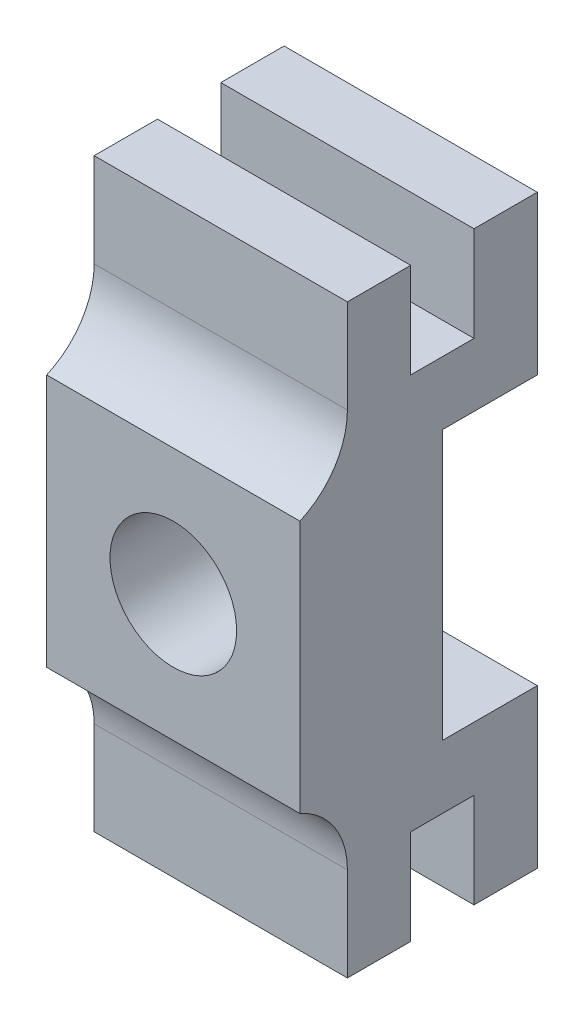
ISO-10303-21;
HEADER;
FILE_DESCRIPTION(('STEP AP214'),'2;1');
FILE_NAME('part.step','',(''),(''),'','','');
FILE_SCHEMA(('AUTOMOTIVE_DESIGN { 1 0 10303 214 1 1 1 1 }'));
ENDSEC;
DATA;
#1=APPLICATION_CONTEXT('core data for automotive mechanical design processes');
#2=APPLICATION_PROTOCOL_DEFINITION('international standard','automotive_design',2000,#1);
#3=PRODUCT_CONTEXT('',#1,'mechanical');
#4=PRODUCT('Part','Part','',(#3));
#5=PRODUCT_RELATED_PRODUCT_CATEGORY('part','',(#4));
#6=PRODUCT_DEFINITION_FORMATION('','',#4);
#7=PRODUCT_DEFINITION_CONTEXT('part definition',#1,'design');
#8=PRODUCT_DEFINITION('design','',#6,#7);
#9=PRODUCT_DEFINITION_SHAPE('','',#8);
#10=(LENGTH_UNIT() NAMED_UNIT(*) SI_UNIT(.MILLI.,.METRE.));
#11=(NAMED_UNIT(*) PLANE_ANGLE_UNIT() SI_UNIT($,.RADIAN.));
#12=(NAMED_UNIT(*) SI_UNIT($,.STERADIAN.) SOLID_ANGLE_UNIT());
#13=UNCERTAINTY_MEASURE_WITH_UNIT(LENGTH_MEASURE(1.E-05),#10,'distance_accuracy_value','');
#14=(GEOMETRIC_REPRESENTATION_CONTEXT(3) GLOBAL_UNCERTAINTY_ASSIGNED_CONTEXT((#13)) GLOBAL_UNIT_ASSIGNED_CONTEXT((#10,
#11,#12)) REPRESENTATION_CONTEXT('',''));
#15=CARTESIAN_POINT('',(0.,0.,0.));
#16=DIRECTION('',(0.,0.,1.));
#17=DIRECTION('',(1.,0.,0.));
#18=AXIS2_PLACEMENT_3D('',#15,#16,#17);
#19=CARTESIAN_POINT('',(8.,-12.5825756949558,11.));
#20=DIRECTION('',(-1.,0.,0.));
#21=DIRECTION('',(0.,0.,1.));
#22=AXIS2_PLACEMENT_3D('',#19,#20,#21);
#23=CYLINDRICAL_SURFACE('',#22,5.);
#24=CARTESIAN_POINT('',(-8.,-12.5825756949558,11.));
#25=DIRECTION('',(-1.,0.,0.));
#26=DIRECTION('',(0.,0.,1.));
#27=AXIS2_PLACEMENT_3D('',#24,#25,#26);
#28=CIRCLE('',#27,5.);
#29=CARTESIAN_POINT('',(-8.,-8.,9.));
#30=VERTEX_POINT('',#29);
#31=CARTESIAN_POINT('',(-8.,-12.5825756949558,6.));
#32=VERTEX_POINT('',#31);
#33=EDGE_CURVE('E208',#30,#32,#28,.T.);
#34=ORIENTED_EDGE('',*,*,#33,.T.);
#35=DIRECTION('',(-1.,0.,0.));
#36=VECTOR('',#35,1.);
#37=CARTESIAN_POINT('',(8.,-12.5825756949558,6.));
#38=LINE('',#37,#36);
#39=CARTESIAN_POINT('',(8.,-12.5825756949558,6.));
#40=VERTEX_POINT('',#39);
#41=EDGE_CURVE('E11',#40,#32,#38,.T.);
#42=ORIENTED_EDGE('',*,*,#41,.F.);
#43=CARTESIAN_POINT('',(8.,-12.5825756949558,11.));
#44=DIRECTION('',(-1.,0.,0.));
#45=DIRECTION('',(0.,0.,1.));
#46=AXIS2_PLACEMENT_3D('',#43,#44,#45);
#47=CIRCLE('',#46,5.);
#48=CARTESIAN_POINT('',(8.,-8.,9.));
#49=VERTEX_POINT('',#48);
#50=EDGE_CURVE('E247',#49,#40,#47,.T.);
#51=ORIENTED_EDGE('',*,*,#50,.F.);
#52=DIRECTION('',(-1.,0.,0.));
#53=VECTOR('',#52,1.);
#54=CARTESIAN_POINT('',(8.,-8.,9.));
#55=LINE('',#54,#53);
#56=EDGE_CURVE('E204',#49,#30,#55,.T.);
#57=ORIENTED_EDGE('',*,*,#56,.T.);
#58=EDGE_LOOP('',(#34,#42,#51,#57));
#59=FACE_BOUND('',#58,.T.);
#60=ADVANCED_FACE('F39',(#59),#23,.F.);
#61=CARTESIAN_POINT('',(8.,-12.5825756949558,6.));
#62=DIRECTION('',(0.,0.,-1.));
#63=DIRECTION('',(0.,1.,0.));
#64=AXIS2_PLACEMENT_3D('',#61,#62,#63);
#65=PLANE('',#64);
#66=DIRECTION('',(0.,-1.,0.));
#67=VECTOR('',#66,1.);
#68=CARTESIAN_POINT('',(-8.,-12.5825756949558,6.));
#69=LINE('',#68,#67);
#70=CARTESIAN_POINT('',(-8.,-18.5,6.));
#71=VERTEX_POINT('',#70);
#72=EDGE_CURVE('E211',#32,#71,#69,.T.);
#73=ORIENTED_EDGE('',*,*,#72,.T.);
#74=DIRECTION('',(-1.,0.,0.));
#75=VECTOR('',#74,1.);
#76=CARTESIAN_POINT('',(8.,-18.5,6.));
#77=LINE('',#76,#75);
#78=CARTESIAN_POINT('',(8.,-18.5,6.));
#79=VERTEX_POINT('',#78);
#80=EDGE_CURVE('E48',#79,#71,#77,.T.);
#81=ORIENTED_EDGE('',*,*,#80,.F.);
#82=DIRECTION('',(0.,-1.,0.));
#83=VECTOR('',#82,1.);
#84=CARTESIAN_POINT('',(8.,-12.5825756949558,6.));
#85=LINE('',#84,#83);
#86=EDGE_CURVE('E135',#40,#79,#85,.T.);
#87=ORIENTED_EDGE('',*,*,#86,.F.);
#88=ORIENTED_EDGE('',*,*,#41,.T.);
#89=EDGE_LOOP('',(#73,#81,#87,#88));
#90=FACE_BOUND('',#89,.T.);
#91=ADVANCED_FACE('F370',(#90),#65,.F.);
#92=CARTESIAN_POINT('',(8.,-18.5,6.));
#93=DIRECTION('',(0.,1.,0.));
#94=DIRECTION('',(0.,0.,1.));
#95=AXIS2_PLACEMENT_3D('',#92,#93,#94);
#96=PLANE('',#95);
#97=DIRECTION('',(0.,0.,-1.));
#98=VECTOR('',#97,1.);
#99=CARTESIAN_POINT('',(-8.,-18.5,6.));
#100=LINE('',#99,#98);
#101=CARTESIAN_POINT('',(-8.,-18.5,2.));
#102=VERTEX_POINT('',#101);
#103=EDGE_CURVE('E214',#71,#102,#100,.T.);
#104=ORIENTED_EDGE('',*,*,#103,.T.);
#105=DIRECTION('',(-1.,0.,0.));
#106=VECTOR('',#105,1.);
#107=CARTESIAN_POINT('',(8.,-18.5,2.));
#108=LINE('',#107,#106);
#109=CARTESIAN_POINT('',(8.,-18.5,2.));
#110=VERTEX_POINT('',#109);
#111=EDGE_CURVE('E290',#110,#102,#108,.T.);
#112=ORIENTED_EDGE('',*,*,#111,.F.);
#113=DIRECTION('',(0.,0.,-1.));
#114=VECTOR('',#113,1.);
#115=CARTESIAN_POINT('',(8.,-18.5,6.));
#116=LINE('',#115,#114);
#117=EDGE_CURVE('E299',#79,#110,#116,.T.);
#118=ORIENTED_EDGE('',*,*,#117,.F.);
#119=ORIENTED_EDGE('',*,*,#80,.T.);
#120=EDGE_LOOP('',(#104,#112,#118,#119));
#121=FACE_BOUND('',#120,.T.);
#122=ADVANCED_FACE('F297',(#121),#96,.F.);
#123=CARTESIAN_POINT('',(8.,-18.5,2.));
#124=DIRECTION('',(0.,0.,1.));
#125=DIRECTION('',(0.,-1.,0.));
#126=AXIS2_PLACEMENT_3D('',#123,#124,#125);
#127=PLANE('',#126);
#128=DIRECTION('',(0.,1.,0.));
#129=VECTOR('',#128,1.);
#130=CARTESIAN_POINT('',(-8.,-18.5,2.));
#131=LINE('',#130,#129);
#132=CARTESIAN_POINT('',(-8.,-12.5,2.));
#133=VERTEX_POINT('',#132);
#134=EDGE_CURVE('E216',#102,#133,#131,.T.);
#135=ORIENTED_EDGE('',*,*,#134,.T.);
#136=DIRECTION('',(-1.,0.,0.));
#137=VECTOR('',#136,1.);
#138=CARTESIAN_POINT('',(8.,-12.5,2.));
#139=LINE('',#138,#137);
#140=CARTESIAN_POINT('',(8.,-12.5,2.));
#141=VERTEX_POINT('',#140);
#142=EDGE_CURVE('E287',#141,#133,#139,.T.);
#143=ORIENTED_EDGE('',*,*,#142,.F.);
#144=DIRECTION('',(0.,1.,0.));
#145=VECTOR('',#144,1.);
#146=CARTESIAN_POINT('',(8.,-18.5,2.));
#147=LINE('',#146,#145);
#148=EDGE_CURVE('E317',#110,#141,#147,.T.);
#149=ORIENTED_EDGE('',*,*,#148,.F.);
#150=ORIENTED_EDGE('',*,*,#111,.T.);
#151=EDGE_LOOP('',(#135,#143,#149,#150));
#152=FACE_BOUND('',#151,.T.);
#153=ADVANCED_FACE('F308',(#152),#127,.F.);
#154=CARTESIAN_POINT('',(8.,-12.5,2.));
#155=DIRECTION('',(0.,1.,0.));
#156=DIRECTION('',(0.,0.,1.));
#157=AXIS2_PLACEMENT_3D('',#154,#155,#156);
#158=PLANE('',#157);
#159=DIRECTION('',(0.,0.,-1.));
#160=VECTOR('',#159,1.);
#161=CARTESIAN_POINT('',(-8.,-12.5,2.));
#162=LINE('',#161,#160);
#163=CARTESIAN_POINT('',(-8.,-12.5,-2.));
#164=VERTEX_POINT('',#163);
#165=EDGE_CURVE('E218',#133,#164,#162,.T.);
#166=ORIENTED_EDGE('',*,*,#165,.T.);
#167=DIRECTION('',(-1.,0.,0.));
#168=VECTOR('',#167,1.);
#169=CARTESIAN_POINT('',(8.,-12.5,-2.));
#170=LINE('',#169,#168);
#171=CARTESIAN_POINT('',(8.,-12.5,-2.));
#172=VERTEX_POINT('',#171);
#173=EDGE_CURVE('E284',#172,#164,#170,.T.);
#174=ORIENTED_EDGE('',*,*,#173,.F.);
#175=DIRECTION('',(0.,0.,-1.));
#176=VECTOR('',#175,1.);
#177=CARTESIAN_POINT('',(8.,-12.5,2.));
#178=LINE('',#177,#176);
#179=EDGE_CURVE('E314',#141,#172,#178,.T.);
#180=ORIENTED_EDGE('',*,*,#179,.F.);
#181=ORIENTED_EDGE('',*,*,#142,.T.);
#182=EDGE_LOOP('',(#166,#174,#180,#181));
#183=FACE_BOUND('',#182,.T.);
#184=ADVANCED_FACE('F312',(#183),#158,.F.);
#185=CARTESIAN_POINT('',(8.,-12.5,-2.));
#186=DIRECTION('',(0.,0.,-1.));
#187=DIRECTION('',(0.,1.,0.));
#188=AXIS2_PLACEMENT_3D('',#185,#186,#187);
#189=PLANE('',#188);
#190=DIRECTION('',(0.,-1.,0.));
#191=VECTOR('',#190,1.);
#192=CARTESIAN_POINT('',(-8.,-12.5,-2.));
#193=LINE('',#192,#191);
#194=CARTESIAN_POINT('',(-8.,-18.5,-2.));
#195=VERTEX_POINT('',#194);
#196=EDGE_CURVE('E220',#164,#195,#193,.T.);
#197=ORIENTED_EDGE('',*,*,#196,.T.);
#198=DIRECTION('',(-1.,0.,0.));
#199=VECTOR('',#198,1.);
#200=CARTESIAN_POINT('',(8.,-18.5,-2.));
#201=LINE('',#200,#199);
#202=CARTESIAN_POINT('',(8.,-18.5,-2.));
#203=VERTEX_POINT('',#202);
#204=EDGE_CURVE('E281',#203,#195,#201,.T.);
#205=ORIENTED_EDGE('',*,*,#204,.F.);
#206=DIRECTION('',(0.,-1.,0.));
#207=VECTOR('',#206,1.);
#208=CARTESIAN_POINT('',(8.,-12.5,-2.));
#209=LINE('',#208,#207);
#210=EDGE_CURVE('E316',#172,#203,#209,.T.);
#211=ORIENTED_EDGE('',*,*,#210,.F.);
#212=ORIENTED_EDGE('',*,*,#173,.T.);
#213=EDGE_LOOP('',(#197,#205,#211,#212));
#214=FACE_BOUND('',#213,.T.);
#215=ADVANCED_FACE('F383',(#214),#189,.F.);
#216=CARTESIAN_POINT('',(8.,-18.5,-2.));
#217=DIRECTION('',(0.,1.,0.));
#218=DIRECTION('',(0.,0.,1.));
#219=AXIS2_PLACEMENT_3D('',#216,#217,#218);
#220=PLANE('',#219);
#221=DIRECTION('',(0.,0.,-1.));
#222=VECTOR('',#221,1.);
#223=CARTESIAN_POINT('',(-8.,-18.5,-2.));
#224=LINE('',#223,#222);
#225=CARTESIAN_POINT('',(-8.,-18.5,-6.));
#226=VERTEX_POINT('',#225);
#227=EDGE_CURVE('E222',#195,#226,#224,.T.);
#228=ORIENTED_EDGE('',*,*,#227,.T.);
#229=DIRECTION('',(-1.,0.,0.));
#230=VECTOR('',#229,1.);
#231=CARTESIAN_POINT('',(8.,-18.5,-6.));
#232=LINE('',#231,#230);
#233=CARTESIAN_POINT('',(8.,-18.5,-6.));
#234=VERTEX_POINT('',#233);
#235=EDGE_CURVE('E278',#234,#226,#232,.T.);
#236=ORIENTED_EDGE('',*,*,#235,.F.);
#237=DIRECTION('',(0.,0.,-1.));
#238=VECTOR('',#237,1.);
#239=CARTESIAN_POINT('',(8.,-18.5,-2.));
#240=LINE('',#239,#238);
#241=EDGE_CURVE('E319',#203,#234,#240,.T.);
#242=ORIENTED_EDGE('',*,*,#241,.F.);
#243=ORIENTED_EDGE('',*,*,#204,.T.);
#244=EDGE_LOOP('',(#228,#236,#242,#243));
#245=FACE_BOUND('',#244,.T.);
#246=ADVANCED_FACE('F386',(#245),#220,.F.);
#247=CARTESIAN_POINT('',(8.,-18.5,-6.));
#248=DIRECTION('',(0.,0.,1.));
#249=DIRECTION('',(0.,-1.,0.));
#250=AXIS2_PLACEMENT_3D('',#247,#248,#249);
#251=PLANE('',#250);
#252=DIRECTION('',(0.,1.,0.));
#253=VECTOR('',#252,1.);
#254=CARTESIAN_POINT('',(-8.,-18.5,-6.));
#255=LINE('',#254,#253);
#256=CARTESIAN_POINT('',(-8.,-8.49999999999999,-6.));
#257=VERTEX_POINT('',#256);
#258=EDGE_CURVE('E224',#226,#257,#255,.T.);
#259=ORIENTED_EDGE('',*,*,#258,.T.);
#260=DIRECTION('',(-1.,0.,0.));
#261=VECTOR('',#260,1.);
#262=CARTESIAN_POINT('',(8.,-8.49999999999999,-6.));
#263=LINE('',#262,#261);
#264=CARTESIAN_POINT('',(8.,-8.49999999999999,-6.));
#265=VERTEX_POINT('',#264);
#266=EDGE_CURVE('E275',#265,#257,#263,.T.);
#267=ORIENTED_EDGE('',*,*,#266,.F.);
#268=DIRECTION('',(0.,1.,0.));
#269=VECTOR('',#268,1.);
#270=CARTESIAN_POINT('',(8.,-18.5,-6.));
#271=LINE('',#270,#269);
#272=EDGE_CURVE('E325',#234,#265,#271,.T.);
#273=ORIENTED_EDGE('',*,*,#272,.F.);
#274=ORIENTED_EDGE('',*,*,#235,.T.);
#275=EDGE_LOOP('',(#259,#267,#273,#274));
#276=FACE_BOUND('',#275,.T.);
#277=ADVANCED_FACE('F390',(#276),#251,.F.);
#278=CARTESIAN_POINT('',(8.,-8.49999999999999,-6.));
#279=DIRECTION('',(0.,-1.,0.));
#280=DIRECTION('',(0.,0.,-1.));
#281=AXIS2_PLACEMENT_3D('',#278,#279,#280);
#282=PLANE('',#281);
#283=DIRECTION('',(0.,0.,1.));
#284=VECTOR('',#283,1.);
#285=CARTESIAN_POINT('',(-8.,-8.49999999999999,-6.));
#286=LINE('',#285,#284);
#287=CARTESIAN_POINT('',(-8.,-8.49999999999999,0.));
#288=VERTEX_POINT('',#287);
#289=EDGE_CURVE('E226',#257,#288,#286,.T.);
#290=ORIENTED_EDGE('',*,*,#289,.T.);
#291=DIRECTION('',(-1.,0.,0.));
#292=VECTOR('',#291,1.);
#293=CARTESIAN_POINT('',(8.,-8.49999999999999,0.));
#294=LINE('',#293,#292);
#295=CARTESIAN_POINT('',(8.,-8.49999999999999,0.));
#296=VERTEX_POINT('',#295);
#297=EDGE_CURVE('E272',#296,#288,#294,.T.);
#298=ORIENTED_EDGE('',*,*,#297,.F.);
#299=DIRECTION('',(0.,0.,1.));
#300=VECTOR('',#299,1.);
#301=CARTESIAN_POINT('',(8.,-8.49999999999999,-6.));
#302=LINE('',#301,#300);
#303=EDGE_CURVE('E327',#265,#296,#302,.T.);
#304=ORIENTED_EDGE('',*,*,#303,.F.);
#305=ORIENTED_EDGE('',*,*,#266,.T.);
#306=EDGE_LOOP('',(#290,#298,#304,#305));
#307=FACE_BOUND('',#306,.T.);
#308=ADVANCED_FACE('F394',(#307),#282,.F.);
#309=CARTESIAN_POINT('',(8.,-8.49999999999999,0.));
#310=DIRECTION('',(0.,0.,1.));
#311=DIRECTION('',(1.,0.,0.));
#312=AXIS2_PLACEMENT_3D('',#309,#310,#311);
#313=PLANE('',#312);
#314=CARTESIAN_POINT('',(0.,0.,0.));
#315=DIRECTION('',(0.,0.,1.));
#316=DIRECTION('',(1.,0.,0.));
#317=AXIS2_PLACEMENT_3D('',#314,#315,#316);
#318=CIRCLE('',#317,4.);
#319=CARTESIAN_POINT('',(4.,0.,0.));
#320=VERTEX_POINT('',#319);
#321=EDGE_CURVE('E212',#320,#320,#318,.T.);
#322=ORIENTED_EDGE('',*,*,#321,.T.);
#323=EDGE_LOOP('',(#322));
#324=FACE_BOUND('',#323,.T.);
#325=DIRECTION('',(0.,1.,0.));
#326=VECTOR('',#325,1.);
#327=CARTESIAN_POINT('',(-8.,-8.49999999999999,0.));
#328=LINE('',#327,#326);
#329=CARTESIAN_POINT('',(-8.,8.49999999999999,0.));
#330=VERTEX_POINT('',#329);
#331=EDGE_CURVE('E228',#288,#330,#328,.T.);
#332=ORIENTED_EDGE('',*,*,#331,.T.);
#333=DIRECTION('',(-1.,0.,0.));
#334=VECTOR('',#333,1.);
#335=CARTESIAN_POINT('',(8.,8.49999999999999,0.));
#336=LINE('',#335,#334);
#337=CARTESIAN_POINT('',(8.,8.49999999999999,0.));
#338=VERTEX_POINT('',#337);
#339=EDGE_CURVE('E269',#338,#330,#336,.T.);
#340=ORIENTED_EDGE('',*,*,#339,.F.);
#341=DIRECTION('',(0.,1.,0.));
#342=VECTOR('',#341,1.);
#343=CARTESIAN_POINT('',(8.,-8.49999999999999,0.));
#344=LINE('',#343,#342);
#345=EDGE_CURVE('E329',#296,#338,#344,.T.);
#346=ORIENTED_EDGE('',*,*,#345,.F.);
#347=ORIENTED_EDGE('',*,*,#297,.T.);
#348=EDGE_LOOP('',(#332,#340,#346,#347));
#349=FACE_BOUND('',#348,.T.);
#350=ADVANCED_FACE('F398',(#324,#349),#313,.F.);
#351=CARTESIAN_POINT('',(8.,8.49999999999999,-6.));
#352=DIRECTION('',(0.,1.,0.));
#353=DIRECTION('',(0.,0.,1.));
#354=AXIS2_PLACEMENT_3D('',#351,#352,#353);
#355=PLANE('',#354);
#356=DIRECTION('',(0.,0.,-1.));
#357=VECTOR('',#356,1.);
#358=CARTESIAN_POINT('',(-8.,8.49999999999999,-6.));
#359=LINE('',#358,#357);
#360=CARTESIAN_POINT('',(-8.,8.49999999999999,-6.));
#361=VERTEX_POINT('',#360);
#362=EDGE_CURVE('E230',#330,#361,#359,.T.);
#363=ORIENTED_EDGE('',*,*,#362,.T.);
#364=DIRECTION('',(-1.,0.,0.));
#365=VECTOR('',#364,1.);
#366=CARTESIAN_POINT('',(8.,8.49999999999999,-6.));
#367=LINE('',#366,#365);
#368=CARTESIAN_POINT('',(8.,8.49999999999999,-6.));
#369=VERTEX_POINT('',#368);
#370=EDGE_CURVE('E266',#369,#361,#367,.T.);
#371=ORIENTED_EDGE('',*,*,#370,.F.);
#372=DIRECTION('',(0.,0.,-1.));
#373=VECTOR('',#372,1.);
#374=CARTESIAN_POINT('',(8.,8.49999999999999,-6.));
#375=LINE('',#374,#373);
#376=EDGE_CURVE('E331',#338,#369,#375,.T.);
#377=ORIENTED_EDGE('',*,*,#376,.F.);
#378=ORIENTED_EDGE('',*,*,#339,.T.);
#379=EDGE_LOOP('',(#363,#371,#377,#378));
#380=FACE_BOUND('',#379,.T.);
#381=ADVANCED_FACE('F401',(#380),#355,.F.);
#382=CARTESIAN_POINT('',(8.,18.5,-6.));
#383=DIRECTION('',(0.,0.,1.));
#384=DIRECTION('',(0.,-1.,0.));
#385=AXIS2_PLACEMENT_3D('',#382,#383,#384);
#386=PLANE('',#385);
#387=DIRECTION('',(0.,1.,0.));
#388=VECTOR('',#387,1.);
#389=CARTESIAN_POINT('',(-8.,18.5,-6.));
#390=LINE('',#389,#388);
#391=CARTESIAN_POINT('',(-8.,18.5,-6.));
#392=VERTEX_POINT('',#391);
#393=EDGE_CURVE('E232',#361,#392,#390,.T.);
#394=ORIENTED_EDGE('',*,*,#393,.T.);
#395=DIRECTION('',(-1.,0.,0.));
#396=VECTOR('',#395,1.);
#397=CARTESIAN_POINT('',(8.,18.5,-6.));
#398=LINE('',#397,#396);
#399=CARTESIAN_POINT('',(8.,18.5,-6.));
#400=VERTEX_POINT('',#399);
#401=EDGE_CURVE('E263',#400,#392,#398,.T.);
#402=ORIENTED_EDGE('',*,*,#401,.F.);
#403=DIRECTION('',(0.,1.,0.));
#404=VECTOR('',#403,1.);
#405=CARTESIAN_POINT('',(8.,18.5,-6.));
#406=LINE('',#405,#404);
#407=EDGE_CURVE('E333',#369,#400,#406,.T.);
#408=ORIENTED_EDGE('',*,*,#407,.F.);
#409=ORIENTED_EDGE('',*,*,#370,.T.);
#410=EDGE_LOOP('',(#394,#402,#408,#409));
#411=FACE_BOUND('',#410,.T.);
#412=ADVANCED_FACE('F405',(#411),#386,.F.);
#413=CARTESIAN_POINT('',(8.,18.5,-2.));
#414=DIRECTION('',(0.,-1.,0.));
#415=DIRECTION('',(0.,0.,-1.));
#416=AXIS2_PLACEMENT_3D('',#413,#414,#415);
#417=PLANE('',#416);
#418=DIRECTION('',(0.,0.,1.));
#419=VECTOR('',#418,1.);
#420=CARTESIAN_POINT('',(-8.,18.5,-2.));
#421=LINE('',#420,#419);
#422=CARTESIAN_POINT('',(-8.,18.5,-2.));
#423=VERTEX_POINT('',#422);
#424=EDGE_CURVE('E234',#392,#423,#421,.T.);
#425=ORIENTED_EDGE('',*,*,#424,.T.);
#426=DIRECTION('',(-1.,0.,0.));
#427=VECTOR('',#426,1.);
#428=CARTESIAN_POINT('',(8.,18.5,-2.));
#429=LINE('',#428,#427);
#430=CARTESIAN_POINT('',(8.,18.5,-2.));
#431=VERTEX_POINT('',#430);
#432=EDGE_CURVE('E260',#431,#423,#429,.T.);
#433=ORIENTED_EDGE('',*,*,#432,.F.);
#434=DIRECTION('',(0.,0.,1.));
#435=VECTOR('',#434,1.);
#436=CARTESIAN_POINT('',(8.,18.5,-2.));
#437=LINE('',#436,#435);
#438=EDGE_CURVE('E335',#400,#431,#437,.T.);
#439=ORIENTED_EDGE('',*,*,#438,.F.);
#440=ORIENTED_EDGE('',*,*,#401,.T.);
#441=EDGE_LOOP('',(#425,#433,#439,#440));
#442=FACE_BOUND('',#441,.T.);
#443=ADVANCED_FACE('F409',(#442),#417,.F.);
#444=CARTESIAN_POINT('',(8.,12.5,-2.));
#445=DIRECTION('',(0.,0.,-1.));
#446=DIRECTION('',(0.,1.,0.));
#447=AXIS2_PLACEMENT_3D('',#444,#445,#446);
#448=PLANE('',#447);
#449=DIRECTION('',(0.,-1.,0.));
#450=VECTOR('',#449,1.);
#451=CARTESIAN_POINT('',(-8.,12.5,-2.));
#452=LINE('',#451,#450);
#453=CARTESIAN_POINT('',(-8.,12.5,-2.));
#454=VERTEX_POINT('',#453);
#455=EDGE_CURVE('E236',#423,#454,#452,.T.);
#456=ORIENTED_EDGE('',*,*,#455,.T.);
#457=DIRECTION('',(-1.,0.,0.));
#458=VECTOR('',#457,1.);
#459=CARTESIAN_POINT('',(8.,12.5,-2.));
#460=LINE('',#459,#458);
#461=CARTESIAN_POINT('',(8.,12.5,-2.));
#462=VERTEX_POINT('',#461);
#463=EDGE_CURVE('E257',#462,#454,#460,.T.);
#464=ORIENTED_EDGE('',*,*,#463,.F.);
#465=DIRECTION('',(0.,-1.,0.));
#466=VECTOR('',#465,1.);
#467=CARTESIAN_POINT('',(8.,12.5,-2.));
#468=LINE('',#467,#466);
#469=EDGE_CURVE('E337',#431,#462,#468,.T.);
#470=ORIENTED_EDGE('',*,*,#469,.F.);
#471=ORIENTED_EDGE('',*,*,#432,.T.);
#472=EDGE_LOOP('',(#456,#464,#470,#471));
#473=FACE_BOUND('',#472,.T.);
#474=ADVANCED_FACE('F413',(#473),#448,.F.);
#475=CARTESIAN_POINT('',(8.,12.5,2.));
#476=DIRECTION('',(0.,-1.,0.));
#477=DIRECTION('',(0.,0.,-1.));
#478=AXIS2_PLACEMENT_3D('',#475,#476,#477);
#479=PLANE('',#478);
#480=DIRECTION('',(0.,0.,1.));
#481=VECTOR('',#480,1.);
#482=CARTESIAN_POINT('',(-8.,12.5,2.));
#483=LINE('',#482,#481);
#484=CARTESIAN_POINT('',(-8.,12.5,2.));
#485=VERTEX_POINT('',#484);
#486=EDGE_CURVE('E238',#454,#485,#483,.T.);
#487=ORIENTED_EDGE('',*,*,#486,.T.);
#488=DIRECTION('',(-1.,0.,0.));
#489=VECTOR('',#488,1.);
#490=CARTESIAN_POINT('',(8.,12.5,2.));
#491=LINE('',#490,#489);
#492=CARTESIAN_POINT('',(8.,12.5,2.));
#493=VERTEX_POINT('',#492);
#494=EDGE_CURVE('E254',#493,#485,#491,.T.);
#495=ORIENTED_EDGE('',*,*,#494,.F.);
#496=DIRECTION('',(0.,0.,1.));
#497=VECTOR('',#496,1.);
#498=CARTESIAN_POINT('',(8.,12.5,2.));
#499=LINE('',#498,#497);
#500=EDGE_CURVE('E339',#462,#493,#499,.T.);
#501=ORIENTED_EDGE('',*,*,#500,.F.);
#502=ORIENTED_EDGE('',*,*,#463,.T.);
#503=EDGE_LOOP('',(#487,#495,#501,#502));
#504=FACE_BOUND('',#503,.T.);
#505=ADVANCED_FACE('F417',(#504),#479,.F.);
#506=CARTESIAN_POINT('',(8.,18.5,2.));
#507=DIRECTION('',(0.,0.,1.));
#508=DIRECTION('',(0.,-1.,0.));
#509=AXIS2_PLACEMENT_3D('',#506,#507,#508);
#510=PLANE('',#509);
#511=DIRECTION('',(0.,1.,0.));
#512=VECTOR('',#511,1.);
#513=CARTESIAN_POINT('',(-8.,18.5,2.));
#514=LINE('',#513,#512);
#515=CARTESIAN_POINT('',(-8.,18.5,2.));
#516=VERTEX_POINT('',#515);
#517=EDGE_CURVE('E240',#485,#516,#514,.T.);
#518=ORIENTED_EDGE('',*,*,#517,.T.);
#519=DIRECTION('',(-1.,0.,0.));
#520=VECTOR('',#519,1.);
#521=CARTESIAN_POINT('',(8.,18.5,2.));
#522=LINE('',#521,#520);
#523=CARTESIAN_POINT('',(8.,18.5,2.));
#524=VERTEX_POINT('',#523);
#525=EDGE_CURVE('E251',#524,#516,#522,.T.);
#526=ORIENTED_EDGE('',*,*,#525,.F.);
#527=DIRECTION('',(0.,1.,0.));
#528=VECTOR('',#527,1.);
#529=CARTESIAN_POINT('',(8.,18.5,2.));
#530=LINE('',#529,#528);
#531=EDGE_CURVE('E341',#493,#524,#530,.T.);
#532=ORIENTED_EDGE('',*,*,#531,.F.);
#533=ORIENTED_EDGE('',*,*,#494,.T.);
#534=EDGE_LOOP('',(#518,#526,#532,#533));
#535=FACE_BOUND('',#534,.T.);
#536=ADVANCED_FACE('F347',(#535),#510,.F.);
#537=CARTESIAN_POINT('',(8.,18.5,6.));
#538=DIRECTION('',(0.,-1.,0.));
#539=DIRECTION('',(0.,0.,-1.));
#540=AXIS2_PLACEMENT_3D('',#537,#538,#539);
#541=PLANE('',#540);
#542=DIRECTION('',(0.,0.,1.));
#543=VECTOR('',#542,1.);
#544=CARTESIAN_POINT('',(-8.,18.5,6.));
#545=LINE('',#544,#543);
#546=CARTESIAN_POINT('',(-8.,18.5,6.));
#547=VERTEX_POINT('',#546);
#548=EDGE_CURVE('E242',#516,#547,#545,.T.);
#549=ORIENTED_EDGE('',*,*,#548,.T.);
#550=DIRECTION('',(-1.,0.,0.));
#551=VECTOR('',#550,1.);
#552=CARTESIAN_POINT('',(8.,18.5,6.));
#553=LINE('',#552,#551);
#554=CARTESIAN_POINT('',(8.,18.5,6.));
#555=VERTEX_POINT('',#554);
#556=EDGE_CURVE('E199',#555,#547,#553,.T.);
#557=ORIENTED_EDGE('',*,*,#556,.F.);
#558=DIRECTION('',(0.,0.,1.));
#559=VECTOR('',#558,1.);
#560=CARTESIAN_POINT('',(8.,18.5,6.));
#561=LINE('',#560,#559);
#562=EDGE_CURVE('E190',#524,#555,#561,.T.);
#563=ORIENTED_EDGE('',*,*,#562,.F.);
#564=ORIENTED_EDGE('',*,*,#525,.T.);
#565=EDGE_LOOP('',(#549,#557,#563,#564));
#566=FACE_BOUND('',#565,.T.);
#567=ADVANCED_FACE('F351',(#566),#541,.F.);
#568=CARTESIAN_POINT('',(8.,12.5825756949558,6.));
#569=DIRECTION('',(0.,0.,-1.));
#570=DIRECTION('',(0.,1.,0.));
#571=AXIS2_PLACEMENT_3D('',#568,#569,#570);
#572=PLANE('',#571);
#573=DIRECTION('',(0.,-1.,0.));
#574=VECTOR('',#573,1.);
#575=CARTESIAN_POINT('',(-8.,12.5825756949558,6.));
#576=LINE('',#575,#574);
#577=CARTESIAN_POINT('',(-8.,12.5825756949558,6.));
#578=VERTEX_POINT('',#577);
#579=EDGE_CURVE('E198',#547,#578,#576,.T.);
#580=ORIENTED_EDGE('',*,*,#579,.T.);
#581=DIRECTION('',(-1.,0.,0.));
#582=VECTOR('',#581,1.);
#583=CARTESIAN_POINT('',(8.,12.5825756949558,6.));
#584=LINE('',#583,#582);
#585=CARTESIAN_POINT('',(8.,12.5825756949558,6.));
#586=VERTEX_POINT('',#585);
#587=EDGE_CURVE('E195',#586,#578,#584,.T.);
#588=ORIENTED_EDGE('',*,*,#587,.F.);
#589=DIRECTION('',(0.,-1.,0.));
#590=VECTOR('',#589,1.);
#591=CARTESIAN_POINT('',(8.,12.5825756949558,6.));
#592=LINE('',#591,#590);
#593=EDGE_CURVE('E184',#555,#586,#592,.T.);
#594=ORIENTED_EDGE('',*,*,#593,.F.);
#595=ORIENTED_EDGE('',*,*,#556,.T.);
#596=EDGE_LOOP('',(#580,#588,#594,#595));
#597=FACE_BOUND('',#596,.T.);
#598=ADVANCED_FACE('F196',(#597),#572,.F.);
#599=CARTESIAN_POINT('',(8.,12.5825756949558,11.));
#600=DIRECTION('',(-1.,0.,0.));
#601=DIRECTION('',(0.,0.,1.));
#602=AXIS2_PLACEMENT_3D('',#599,#600,#601);
#603=CYLINDRICAL_SURFACE('',#602,5.);
#604=CARTESIAN_POINT('',(-8.,12.5825756949558,11.));
#605=DIRECTION('',(-1.,0.,0.));
#606=DIRECTION('',(0.,0.,-1.));
#607=AXIS2_PLACEMENT_3D('',#604,#605,#606);
#608=CIRCLE('',#607,5.);
#609=CARTESIAN_POINT('',(-8.,8.,9.));
#610=VERTEX_POINT('',#609);
#611=EDGE_CURVE('E121',#578,#610,#608,.T.);
#612=ORIENTED_EDGE('',*,*,#611,.T.);
#613=DIRECTION('',(-1.,0.,0.));
#614=VECTOR('',#613,1.);
#615=CARTESIAN_POINT('',(8.,8.,9.));
#616=LINE('',#615,#614);
#617=CARTESIAN_POINT('',(8.,8.,9.));
#618=VERTEX_POINT('',#617);
#619=EDGE_CURVE('E200',#618,#610,#616,.T.);
#620=ORIENTED_EDGE('',*,*,#619,.F.);
#621=CARTESIAN_POINT('',(8.,12.5825756949558,11.));
#622=DIRECTION('',(-1.,0.,0.));
#623=DIRECTION('',(0.,0.,-1.));
#624=AXIS2_PLACEMENT_3D('',#621,#622,#623);
#625=CIRCLE('',#624,5.);
#626=EDGE_CURVE('E188',#586,#618,#625,.T.);
#627=ORIENTED_EDGE('',*,*,#626,.F.);
#628=ORIENTED_EDGE('',*,*,#587,.T.);
#629=EDGE_LOOP('',(#612,#620,#627,#628));
#630=FACE_BOUND('',#629,.T.);
#631=ADVANCED_FACE('F202',(#630),#603,.F.);
#632=CARTESIAN_POINT('',(8.,8.,9.));
#633=DIRECTION('',(0.,0.,-1.));
#634=DIRECTION('',(-1.,0.,0.));
#635=AXIS2_PLACEMENT_3D('',#632,#633,#634);
#636=PLANE('',#635);
#637=CARTESIAN_POINT('',(0.,0.,9.));
#638=DIRECTION('',(0.,0.,-1.));
#639=DIRECTION('',(-1.,0.,0.));
#640=AXIS2_PLACEMENT_3D('',#637,#638,#639);
#641=CIRCLE('',#640,4.);
#642=CARTESIAN_POINT('',(4.,0.,9.));
#643=VERTEX_POINT('',#642);
#644=EDGE_CURVE('E42',#643,#643,#641,.T.);
#645=ORIENTED_EDGE('',*,*,#644,.T.);
#646=EDGE_LOOP('',(#645));
#647=FACE_BOUND('',#646,.T.);
#648=DIRECTION('',(0.,-1.,0.));
#649=VECTOR('',#648,1.);
#650=CARTESIAN_POINT('',(-8.,8.,9.));
#651=LINE('',#650,#649);
#652=EDGE_CURVE('E127',#610,#30,#651,.T.);
#653=ORIENTED_EDGE('',*,*,#652,.T.);
#654=ORIENTED_EDGE('',*,*,#56,.F.);
#655=DIRECTION('',(0.,-1.,0.));
#656=VECTOR('',#655,1.);
#657=CARTESIAN_POINT('',(8.,8.,9.));
#658=LINE('',#657,#656);
#659=EDGE_CURVE('E56',#618,#49,#658,.T.);
#660=ORIENTED_EDGE('',*,*,#659,.F.);
#661=ORIENTED_EDGE('',*,*,#619,.T.);
#662=EDGE_LOOP('',(#653,#654,#660,#661));
#663=FACE_BOUND('',#662,.T.);
#664=ADVANCED_FACE('F355',(#647,#663),#636,.F.);
#665=CARTESIAN_POINT('',(8.,-12.5825756949558,11.));
#666=DIRECTION('',(-1.,0.,0.));
#667=DIRECTION('',(0.,0.,1.));
#668=AXIS2_PLACEMENT_3D('',#665,#666,#667);
#669=PLANE('',#668);
#670=ORIENTED_EDGE('',*,*,#50,.T.);
#671=ORIENTED_EDGE('',*,*,#86,.T.);
#672=ORIENTED_EDGE('',*,*,#117,.T.);
#673=ORIENTED_EDGE('',*,*,#148,.T.);
#674=ORIENTED_EDGE('',*,*,#179,.T.);
#675=ORIENTED_EDGE('',*,*,#210,.T.);
#676=ORIENTED_EDGE('',*,*,#241,.T.);
#677=ORIENTED_EDGE('',*,*,#272,.T.);
#678=ORIENTED_EDGE('',*,*,#303,.T.);
#679=ORIENTED_EDGE('',*,*,#345,.T.);
#680=ORIENTED_EDGE('',*,*,#376,.T.);
#681=ORIENTED_EDGE('',*,*,#407,.T.);
#682=ORIENTED_EDGE('',*,*,#438,.T.);
#683=ORIENTED_EDGE('',*,*,#469,.T.);
#684=ORIENTED_EDGE('',*,*,#500,.T.);
#685=ORIENTED_EDGE('',*,*,#531,.T.);
#686=ORIENTED_EDGE('',*,*,#562,.T.);
#687=ORIENTED_EDGE('',*,*,#593,.T.);
#688=ORIENTED_EDGE('',*,*,#626,.T.);
#689=ORIENTED_EDGE('',*,*,#659,.T.);
#690=EDGE_LOOP('',(#670,#671,#672,#673,#674,#675,#676,#677,#678,#679,#680,#681,#682,#683,#684,
#685,#686,#687,#688,#689));
#691=FACE_BOUND('',#690,.T.);
#692=ADVANCED_FACE('F186',(#691),#669,.F.);
#693=CARTESIAN_POINT('',(-8.,-12.5825756949558,11.));
#694=DIRECTION('',(-1.,0.,0.));
#695=DIRECTION('',(0.,0.,1.));
#696=AXIS2_PLACEMENT_3D('',#693,#694,#695);
#697=PLANE('',#696);
#698=ORIENTED_EDGE('',*,*,#33,.F.);
#699=ORIENTED_EDGE('',*,*,#652,.F.);
#700=ORIENTED_EDGE('',*,*,#611,.F.);
#701=ORIENTED_EDGE('',*,*,#579,.F.);
#702=ORIENTED_EDGE('',*,*,#548,.F.);
#703=ORIENTED_EDGE('',*,*,#517,.F.);
#704=ORIENTED_EDGE('',*,*,#486,.F.);
#705=ORIENTED_EDGE('',*,*,#455,.F.);
#706=ORIENTED_EDGE('',*,*,#424,.F.);
#707=ORIENTED_EDGE('',*,*,#393,.F.);
#708=ORIENTED_EDGE('',*,*,#362,.F.);
#709=ORIENTED_EDGE('',*,*,#331,.F.);
#710=ORIENTED_EDGE('',*,*,#289,.F.);
#711=ORIENTED_EDGE('',*,*,#258,.F.);
#712=ORIENTED_EDGE('',*,*,#227,.F.);
#713=ORIENTED_EDGE('',*,*,#196,.F.);
#714=ORIENTED_EDGE('',*,*,#165,.F.);
#715=ORIENTED_EDGE('',*,*,#134,.F.);
#716=ORIENTED_EDGE('',*,*,#103,.F.);
#717=ORIENTED_EDGE('',*,*,#72,.F.);
#718=EDGE_LOOP('',(#698,#699,#700,#701,#702,#703,#704,#705,#706,#707,#708,#709,#710,#711,#712,
#713,#714,#715,#716,#717));
#719=FACE_BOUND('',#718,.T.);
#720=ADVANCED_FACE('F303',(#719),#697,.T.);
#721=CARTESIAN_POINT('',(0.,0.,-6.));
#722=DIRECTION('',(0.,0.,1.));
#723=DIRECTION('',(1.,0.,0.));
#724=AXIS2_PLACEMENT_3D('',#721,#722,#723);
#725=CYLINDRICAL_SURFACE('',#724,4.);
#726=CARTESIAN_POINT('',(4.,0.,9.));
#727=CARTESIAN_POINT('',(4.,0.,8.90625));
#728=CARTESIAN_POINT('',(4.,0.,8.8125));
#729=CARTESIAN_POINT('',(4.,0.,8.62499999999999));
#730=CARTESIAN_POINT('',(4.,0.,8.53124999999999));
#731=CARTESIAN_POINT('',(4.,0.,8.34374999999999));
#732=CARTESIAN_POINT('',(4.,0.,8.25));
#733=CARTESIAN_POINT('',(4.,0.,8.0625));
#734=CARTESIAN_POINT('',(4.,0.,7.96875));
#735=CARTESIAN_POINT('',(4.,0.,7.78125));
#736=CARTESIAN_POINT('',(4.,0.,7.6875));
#737=CARTESIAN_POINT('',(4.,0.,7.5));
#738=CARTESIAN_POINT('',(4.,0.,7.40625));
#739=CARTESIAN_POINT('',(4.,0.,7.21875));
#740=CARTESIAN_POINT('',(4.,0.,7.125));
#741=CARTESIAN_POINT('',(4.,0.,6.9375));
#742=CARTESIAN_POINT('',(4.,0.,6.84375));
#743=CARTESIAN_POINT('',(4.,0.,6.65625));
#744=CARTESIAN_POINT('',(4.,0.,6.5625));
#745=CARTESIAN_POINT('',(4.,0.,6.375));
#746=CARTESIAN_POINT('',(4.,0.,6.28125));
#747=CARTESIAN_POINT('',(4.,0.,6.09375));
#748=CARTESIAN_POINT('',(4.,0.,6.));
#749=CARTESIAN_POINT('',(4.,0.,5.8125));
#750=CARTESIAN_POINT('',(4.,0.,5.71875));
#751=CARTESIAN_POINT('',(4.,0.,5.53125));
#752=CARTESIAN_POINT('',(4.,0.,5.4375));
#753=CARTESIAN_POINT('',(4.,0.,5.25));
#754=CARTESIAN_POINT('',(4.,0.,5.15625));
#755=CARTESIAN_POINT('',(4.,0.,4.96875));
#756=CARTESIAN_POINT('',(4.,0.,4.875));
#757=CARTESIAN_POINT('',(4.,0.,4.6875));
#758=CARTESIAN_POINT('',(4.,0.,4.59375));
#759=CARTESIAN_POINT('',(4.,0.,4.40625));
#760=CARTESIAN_POINT('',(4.,0.,4.3125));
#761=CARTESIAN_POINT('',(4.,0.,4.125));
#762=CARTESIAN_POINT('',(4.,0.,4.03125));
#763=CARTESIAN_POINT('',(4.,0.,3.84375));
#764=CARTESIAN_POINT('',(4.,0.,3.75));
#765=CARTESIAN_POINT('',(4.,0.,3.5625));
#766=CARTESIAN_POINT('',(4.,0.,3.46875));
#767=CARTESIAN_POINT('',(4.,0.,3.28125));
#768=CARTESIAN_POINT('',(4.,0.,3.1875));
#769=CARTESIAN_POINT('',(4.,0.,3.));
#770=CARTESIAN_POINT('',(4.,0.,2.90625));
#771=CARTESIAN_POINT('',(4.,0.,2.71875));
#772=CARTESIAN_POINT('',(4.,0.,2.625));
#773=CARTESIAN_POINT('',(4.,0.,2.4375));
#774=CARTESIAN_POINT('',(4.,0.,2.34375));
#775=CARTESIAN_POINT('',(4.,0.,2.15625));
#776=CARTESIAN_POINT('',(4.,0.,2.0625));
#777=CARTESIAN_POINT('',(4.,0.,1.875));
#778=CARTESIAN_POINT('',(4.,0.,1.78125));
#779=CARTESIAN_POINT('',(4.,0.,1.59375));
#780=CARTESIAN_POINT('',(4.,0.,1.5));
#781=CARTESIAN_POINT('',(4.,0.,1.3125));
#782=CARTESIAN_POINT('',(4.,0.,1.21875));
#783=CARTESIAN_POINT('',(4.,0.,1.03125));
#784=CARTESIAN_POINT('',(4.,0.,0.937499999999998));
#785=CARTESIAN_POINT('',(4.,0.,0.749999999999999));
#786=CARTESIAN_POINT('',(4.,0.,0.656249999999999));
#787=CARTESIAN_POINT('',(4.,0.,0.46875));
#788=CARTESIAN_POINT('',(4.,0.,0.375));
#789=CARTESIAN_POINT('',(4.,0.,0.187499999999999));
#790=CARTESIAN_POINT('',(4.,0.,0.0937499999999991));
#791=CARTESIAN_POINT('',(4.,0.,0.));
#792=B_SPLINE_CURVE_WITH_KNOTS('',3,(#726,#727,#728,#729,#730,#731,#732,#733,#734,#735,#736,
#737,#738,#739,#740,#741,#742,#743,#744,#745,#746,#747,#748,#749,#750,#751,#752,#753,#754,#755,
#756,#757,#758,#759,#760,#761,#762,#763,#764,#765,#766,#767,#768,#769,#770,#771,#772,#773,#774,
#775,#776,#777,#778,#779,#780,#781,#782,#783,#784,#785,#786,#787,#788,#789,#790,#791),
.UNSPECIFIED.,.F.,.F.,(4,2,2,2,2,2,2,2,2,2,2,2,2,2,2,2,2,2,2,2,2,2,2,2,2,2,2,2,2,2,2,2,4),(0.,
0.28125,0.5625,0.843749999999999,1.125,1.40625,1.6875,1.96875,2.25,2.53125,2.8125,3.09375,3.375,
3.65625,3.9375,4.21875,4.5,4.78125,5.0625,5.34375,5.625,5.90625,6.1875,6.46875,6.75,7.03125,
7.3125,7.59375,7.875,8.15625,8.43749999999999,8.71875,9.),.UNSPECIFIED.);
#793=EDGE_CURVE('BSEAM447',#643,#320,#792,.T.);
#794=ORIENTED_EDGE('',*,*,#644,.F.);
#795=ORIENTED_EDGE('',*,*,#321,.F.);
#796=ORIENTED_EDGE('',*,*,#793,.T.);
#797=ORIENTED_EDGE('',*,*,#793,.F.);
#798=EDGE_LOOP('',(#794,#796,#795,#797));
#799=FACE_BOUND('',#798,.T.);
#800=ADVANCED_FACE('F447',(#799),#725,.F.);
#801=CLOSED_SHELL('',(#60,#91,#122,#153,#184,#215,#246,#277,#308,#350,#381,#412,#443,#474,#505,
#536,#567,#598,#631,#664,#692,#720,#800));
#802=MANIFOLD_SOLID_BREP('B2',#801);
#803=ADVANCED_BREP_SHAPE_REPRESENTATION('',(#18,#802),#14);
#804=SHAPE_DEFINITION_REPRESENTATION(#9,#803);
ENDSEC;
END-ISO-10303-21;
